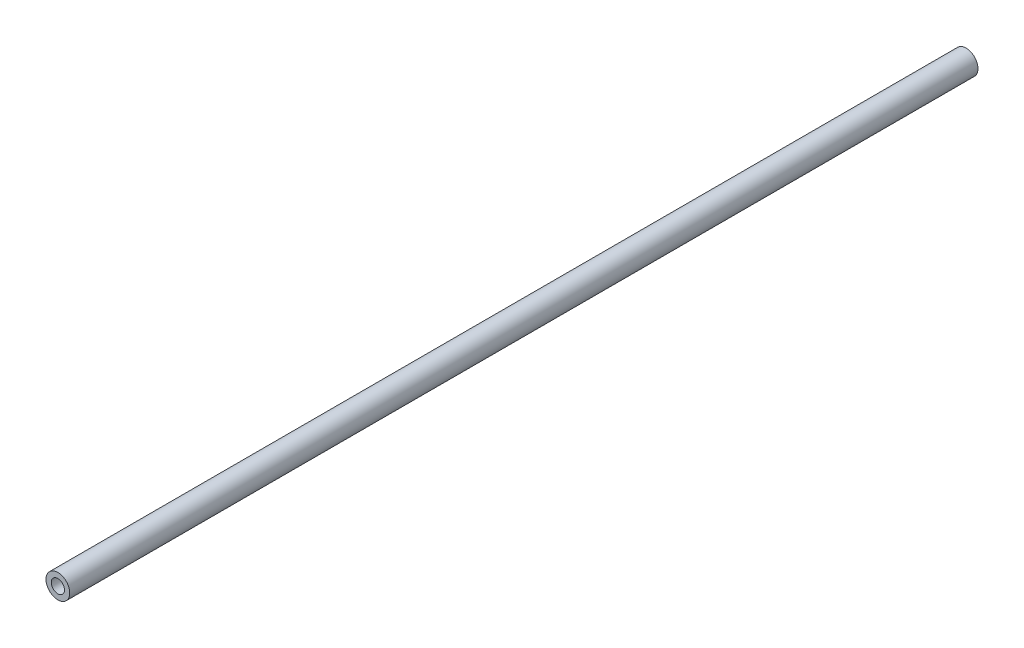
ISO-10303-21;
HEADER;
FILE_DESCRIPTION(('STEP AP214'),'2;1');
FILE_NAME('part.step','',(''),(''),'','','');
FILE_SCHEMA(('AUTOMOTIVE_DESIGN { 1 0 10303 214 1 1 1 1 }'));
ENDSEC;
DATA;
#1=APPLICATION_CONTEXT('core data for automotive mechanical design processes');
#2=APPLICATION_PROTOCOL_DEFINITION('international standard','automotive_design',2000,#1);
#3=PRODUCT_CONTEXT('',#1,'mechanical');
#4=PRODUCT('Part','Part','',(#3));
#5=PRODUCT_RELATED_PRODUCT_CATEGORY('part','',(#4));
#6=PRODUCT_DEFINITION_FORMATION('','',#4);
#7=PRODUCT_DEFINITION_CONTEXT('part definition',#1,'design');
#8=PRODUCT_DEFINITION('design','',#6,#7);
#9=PRODUCT_DEFINITION_SHAPE('','',#8);
#10=(LENGTH_UNIT() NAMED_UNIT(*) SI_UNIT(.MILLI.,.METRE.));
#11=(NAMED_UNIT(*) PLANE_ANGLE_UNIT() SI_UNIT($,.RADIAN.));
#12=(NAMED_UNIT(*) SI_UNIT($,.STERADIAN.) SOLID_ANGLE_UNIT());
#13=UNCERTAINTY_MEASURE_WITH_UNIT(LENGTH_MEASURE(1.E-05),#10,'distance_accuracy_value','');
#14=(GEOMETRIC_REPRESENTATION_CONTEXT(3) GLOBAL_UNCERTAINTY_ASSIGNED_CONTEXT((#13)) GLOBAL_UNIT_ASSIGNED_CONTEXT((#10,
#11,#12)) REPRESENTATION_CONTEXT('',''));
#15=CARTESIAN_POINT('',(0.,0.,0.));
#16=DIRECTION('',(0.,0.,1.));
#17=DIRECTION('',(1.,0.,0.));
#18=AXIS2_PLACEMENT_3D('',#15,#16,#17);
#19=CARTESIAN_POINT('',(0.,0.,653.17));
#20=DIRECTION('',(0.,0.,1.));
#21=DIRECTION('',(1.,0.,0.));
#22=AXIS2_PLACEMENT_3D('',#19,#20,#21);
#23=PLANE('',#22);
#24=CARTESIAN_POINT('',(0.,0.,653.17));
#25=DIRECTION('',(0.,0.,1.));
#26=DIRECTION('',(1.,0.,0.));
#27=AXIS2_PLACEMENT_3D('',#24,#25,#26);
#28=CIRCLE('',#27,8.55);
#29=CARTESIAN_POINT('',(8.55,0.,653.17));
#30=VERTEX_POINT('',#29);
#31=EDGE_CURVE('E10',#30,#30,#28,.T.);
#32=ORIENTED_EDGE('',*,*,#31,.T.);
#33=EDGE_LOOP('',(#32));
#34=FACE_BOUND('',#33,.T.);
#35=CARTESIAN_POINT('',(0.,0.,653.17));
#36=DIRECTION('',(0.,0.,1.));
#37=DIRECTION('',(1.,0.,0.));
#38=AXIS2_PLACEMENT_3D('',#35,#36,#37);
#39=CIRCLE('',#38,4.765);
#40=CARTESIAN_POINT('',(4.765,0.,653.17));
#41=VERTEX_POINT('',#40);
#42=EDGE_CURVE('E44',#41,#41,#39,.T.);
#43=ORIENTED_EDGE('',*,*,#42,.F.);
#44=EDGE_LOOP('',(#43));
#45=FACE_BOUND('',#44,.T.);
#46=ADVANCED_FACE('F33',(#34,#45),#23,.T.);
#47=CARTESIAN_POINT('',(0.,0.,0.));
#48=DIRECTION('',(0.,0.,1.));
#49=DIRECTION('',(1.,0.,0.));
#50=AXIS2_PLACEMENT_3D('',#47,#48,#49);
#51=PLANE('',#50);
#52=CARTESIAN_POINT('',(0.,0.,0.));
#53=DIRECTION('',(0.,0.,1.));
#54=DIRECTION('',(1.,0.,0.));
#55=AXIS2_PLACEMENT_3D('',#52,#53,#54);
#56=CIRCLE('',#55,8.55);
#57=CARTESIAN_POINT('',(8.55,0.,0.));
#58=VERTEX_POINT('',#57);
#59=EDGE_CURVE('E37',#58,#58,#56,.T.);
#60=ORIENTED_EDGE('',*,*,#59,.F.);
#61=EDGE_LOOP('',(#60));
#62=FACE_BOUND('',#61,.T.);
#63=CARTESIAN_POINT('',(0.,0.,0.));
#64=DIRECTION('',(0.,0.,1.));
#65=DIRECTION('',(1.,0.,0.));
#66=AXIS2_PLACEMENT_3D('',#63,#64,#65);
#67=CIRCLE('',#66,4.765);
#68=CARTESIAN_POINT('',(4.765,0.,0.));
#69=VERTEX_POINT('',#68);
#70=EDGE_CURVE('E46',#69,#69,#67,.T.);
#71=ORIENTED_EDGE('',*,*,#70,.T.);
#72=EDGE_LOOP('',(#71));
#73=FACE_BOUND('',#72,.T.);
#74=ADVANCED_FACE('F56',(#62,#73),#51,.F.);
#75=CARTESIAN_POINT('',(0.,0.,653.17));
#76=DIRECTION('',(0.,0.,-1.));
#77=DIRECTION('',(-1.,0.,0.));
#78=AXIS2_PLACEMENT_3D('',#75,#76,#77);
#79=CYLINDRICAL_SURFACE('',#78,8.55);
#80=ORIENTED_EDGE('',*,*,#31,.F.);
#81=EDGE_LOOP('',(#80));
#82=FACE_BOUND('',#81,.T.);
#83=ORIENTED_EDGE('',*,*,#59,.T.);
#84=EDGE_LOOP('',(#83));
#85=FACE_BOUND('',#84,.T.);
#86=ADVANCED_FACE('F35',(#82,#85),#79,.T.);
#87=CARTESIAN_POINT('',(0.,0.,653.17));
#88=DIRECTION('',(0.,0.,-1.));
#89=DIRECTION('',(-1.,0.,0.));
#90=AXIS2_PLACEMENT_3D('',#87,#88,#89);
#91=CYLINDRICAL_SURFACE('',#90,4.765);
#92=ORIENTED_EDGE('',*,*,#42,.T.);
#93=EDGE_LOOP('',(#92));
#94=FACE_BOUND('',#93,.T.);
#95=ORIENTED_EDGE('',*,*,#70,.F.);
#96=EDGE_LOOP('',(#95));
#97=FACE_BOUND('',#96,.T.);
#98=ADVANCED_FACE('F52',(#94,#97),#91,.F.);
#99=CLOSED_SHELL('',(#46,#74,#86,#98));
#100=MANIFOLD_SOLID_BREP('B2',#99);
#101=ADVANCED_BREP_SHAPE_REPRESENTATION('',(#18,#100),#14);
#102=SHAPE_DEFINITION_REPRESENTATION(#9,#101);
ENDSEC;
END-ISO-10303-21;
